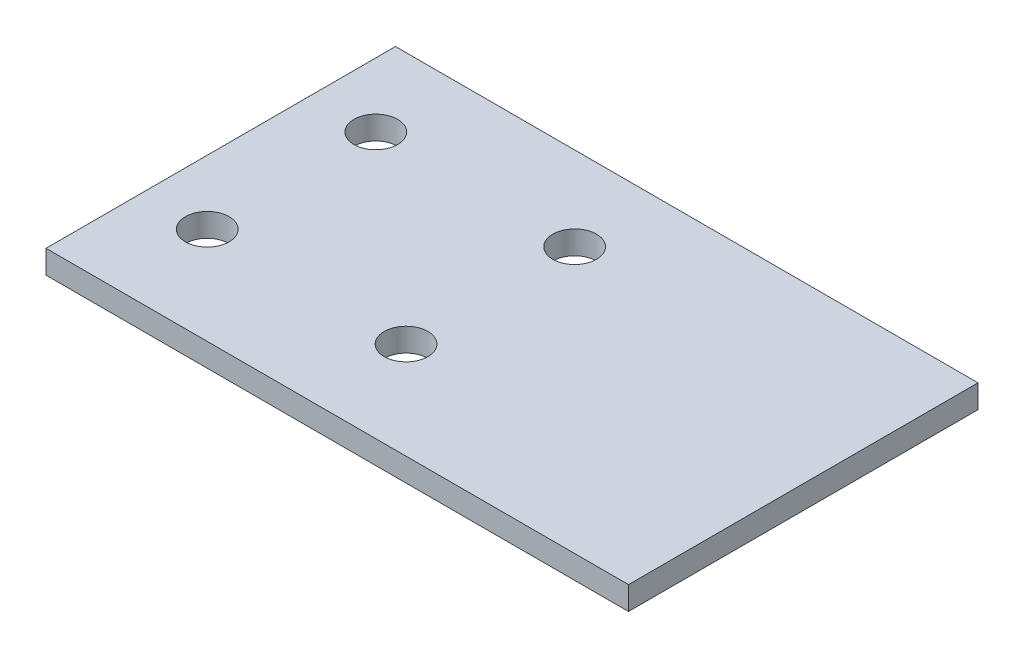
ISO-10303-21;
HEADER;
FILE_DESCRIPTION(('STEP AP214'),'2;1');
FILE_NAME('part.step','',(''),(''),'','','');
FILE_SCHEMA(('AUTOMOTIVE_DESIGN { 1 0 10303 214 1 1 1 1 }'));
ENDSEC;
DATA;
#1=APPLICATION_CONTEXT('core data for automotive mechanical design processes');
#2=APPLICATION_PROTOCOL_DEFINITION('international standard','automotive_design',2000,#1);
#3=PRODUCT_CONTEXT('',#1,'mechanical');
#4=PRODUCT('Part','Part','',(#3));
#5=PRODUCT_RELATED_PRODUCT_CATEGORY('part','',(#4));
#6=PRODUCT_DEFINITION_FORMATION('','',#4);
#7=PRODUCT_DEFINITION_CONTEXT('part definition',#1,'design');
#8=PRODUCT_DEFINITION('design','',#6,#7);
#9=PRODUCT_DEFINITION_SHAPE('','',#8);
#10=(LENGTH_UNIT() NAMED_UNIT(*) SI_UNIT(.MILLI.,.METRE.));
#11=(NAMED_UNIT(*) PLANE_ANGLE_UNIT() SI_UNIT($,.RADIAN.));
#12=(NAMED_UNIT(*) SI_UNIT($,.STERADIAN.) SOLID_ANGLE_UNIT());
#13=UNCERTAINTY_MEASURE_WITH_UNIT(LENGTH_MEASURE(1.E-05),#10,'distance_accuracy_value','');
#14=(GEOMETRIC_REPRESENTATION_CONTEXT(3) GLOBAL_UNCERTAINTY_ASSIGNED_CONTEXT((#13)) GLOBAL_UNIT_ASSIGNED_CONTEXT((#10,
#11,#12)) REPRESENTATION_CONTEXT('',''));
#15=CARTESIAN_POINT('',(0.,0.,0.));
#16=DIRECTION('',(0.,0.,1.));
#17=DIRECTION('',(1.,0.,0.));
#18=AXIS2_PLACEMENT_3D('',#15,#16,#17);
#19=CARTESIAN_POINT('',(-63.5,5.08,-38.1));
#20=DIRECTION('',(1.,0.,0.));
#21=DIRECTION('',(0.,0.,-1.));
#22=AXIS2_PLACEMENT_3D('',#19,#20,#21);
#23=PLANE('',#22);
#24=DIRECTION('',(0.,0.,1.));
#25=VECTOR('',#24,1.);
#26=CARTESIAN_POINT('',(-63.5,0.,-38.1));
#27=LINE('',#26,#25);
#28=CARTESIAN_POINT('',(-63.5,0.,-38.1));
#29=VERTEX_POINT('',#28);
#30=CARTESIAN_POINT('',(-63.5,0.,38.1));
#31=VERTEX_POINT('',#30);
#32=EDGE_CURVE('E96',#29,#31,#27,.T.);
#33=ORIENTED_EDGE('',*,*,#32,.T.);
#34=DIRECTION('',(0.,-1.,0.));
#35=VECTOR('',#34,1.);
#36=CARTESIAN_POINT('',(-63.5,5.08,38.1));
#37=LINE('',#36,#35);
#38=CARTESIAN_POINT('',(-63.5,5.08,38.1));
#39=VERTEX_POINT('',#38);
#40=EDGE_CURVE('E11',#39,#31,#37,.T.);
#41=ORIENTED_EDGE('',*,*,#40,.F.);
#42=DIRECTION('',(0.,0.,1.));
#43=VECTOR('',#42,1.);
#44=CARTESIAN_POINT('',(-63.5,5.08,-38.1));
#45=LINE('',#44,#43);
#46=CARTESIAN_POINT('',(-63.5,5.08,-38.1));
#47=VERTEX_POINT('',#46);
#48=EDGE_CURVE('E84',#47,#39,#45,.T.);
#49=ORIENTED_EDGE('',*,*,#48,.F.);
#50=DIRECTION('',(0.,-1.,0.));
#51=VECTOR('',#50,1.);
#52=CARTESIAN_POINT('',(-63.5,5.08,-38.1));
#53=LINE('',#52,#51);
#54=EDGE_CURVE('E92',#47,#29,#53,.T.);
#55=ORIENTED_EDGE('',*,*,#54,.T.);
#56=EDGE_LOOP('',(#33,#41,#49,#55));
#57=FACE_BOUND('',#56,.T.);
#58=ADVANCED_FACE('F33',(#57),#23,.F.);
#59=CARTESIAN_POINT('',(-63.5,5.08,38.1));
#60=DIRECTION('',(0.,0.,-1.));
#61=DIRECTION('',(-1.,0.,0.));
#62=AXIS2_PLACEMENT_3D('',#59,#60,#61);
#63=PLANE('',#62);
#64=DIRECTION('',(1.,0.,0.));
#65=VECTOR('',#64,1.);
#66=CARTESIAN_POINT('',(-63.5,0.,38.1));
#67=LINE('',#66,#65);
#68=CARTESIAN_POINT('',(63.5,0.,38.1));
#69=VERTEX_POINT('',#68);
#70=EDGE_CURVE('E88',#31,#69,#67,.T.);
#71=ORIENTED_EDGE('',*,*,#70,.T.);
#72=DIRECTION('',(0.,-1.,0.));
#73=VECTOR('',#72,1.);
#74=CARTESIAN_POINT('',(63.5,5.08,38.1));
#75=LINE('',#74,#73);
#76=CARTESIAN_POINT('',(63.5,5.08,38.1));
#77=VERTEX_POINT('',#76);
#78=EDGE_CURVE('E41',#77,#69,#75,.T.);
#79=ORIENTED_EDGE('',*,*,#78,.F.);
#80=DIRECTION('',(1.,0.,0.));
#81=VECTOR('',#80,1.);
#82=CARTESIAN_POINT('',(-63.5,5.08,38.1));
#83=LINE('',#82,#81);
#84=EDGE_CURVE('E79',#39,#77,#83,.T.);
#85=ORIENTED_EDGE('',*,*,#84,.F.);
#86=ORIENTED_EDGE('',*,*,#40,.T.);
#87=EDGE_LOOP('',(#71,#79,#85,#86));
#88=FACE_BOUND('',#87,.T.);
#89=ADVANCED_FACE('F87',(#88),#63,.F.);
#90=CARTESIAN_POINT('',(63.5,5.08,-38.1));
#91=DIRECTION('',(-1.,0.,0.));
#92=DIRECTION('',(0.,0.,1.));
#93=AXIS2_PLACEMENT_3D('',#90,#91,#92);
#94=PLANE('',#93);
#95=DIRECTION('',(0.,0.,-1.));
#96=VECTOR('',#95,1.);
#97=CARTESIAN_POINT('',(63.5,0.,-38.1));
#98=LINE('',#97,#96);
#99=CARTESIAN_POINT('',(63.5,0.,-38.1));
#100=VERTEX_POINT('',#99);
#101=EDGE_CURVE('E66',#69,#100,#98,.T.);
#102=ORIENTED_EDGE('',*,*,#101,.T.);
#103=DIRECTION('',(0.,-1.,0.));
#104=VECTOR('',#103,1.);
#105=CARTESIAN_POINT('',(63.5,5.08,-38.1));
#106=LINE('',#105,#104);
#107=CARTESIAN_POINT('',(63.5,5.08,-38.1));
#108=VERTEX_POINT('',#107);
#109=EDGE_CURVE('E89',#108,#100,#106,.T.);
#110=ORIENTED_EDGE('',*,*,#109,.F.);
#111=DIRECTION('',(0.,0.,-1.));
#112=VECTOR('',#111,1.);
#113=CARTESIAN_POINT('',(63.5,5.08,-38.1));
#114=LINE('',#113,#112);
#115=EDGE_CURVE('E82',#77,#108,#114,.T.);
#116=ORIENTED_EDGE('',*,*,#115,.F.);
#117=ORIENTED_EDGE('',*,*,#78,.T.);
#118=EDGE_LOOP('',(#102,#110,#116,#117));
#119=FACE_BOUND('',#118,.T.);
#120=ADVANCED_FACE('F90',(#119),#94,.F.);
#121=CARTESIAN_POINT('',(-63.5,5.08,-38.1));
#122=DIRECTION('',(0.,0.,1.));
#123=DIRECTION('',(1.,0.,0.));
#124=AXIS2_PLACEMENT_3D('',#121,#122,#123);
#125=PLANE('',#124);
#126=DIRECTION('',(-1.,0.,0.));
#127=VECTOR('',#126,1.);
#128=CARTESIAN_POINT('',(-63.5,0.,-38.1));
#129=LINE('',#128,#127);
#130=EDGE_CURVE('E72',#100,#29,#129,.T.);
#131=ORIENTED_EDGE('',*,*,#130,.T.);
#132=ORIENTED_EDGE('',*,*,#54,.F.);
#133=DIRECTION('',(-1.,0.,0.));
#134=VECTOR('',#133,1.);
#135=CARTESIAN_POINT('',(-63.5,5.08,-38.1));
#136=LINE('',#135,#134);
#137=EDGE_CURVE('E49',#108,#47,#136,.T.);
#138=ORIENTED_EDGE('',*,*,#137,.F.);
#139=ORIENTED_EDGE('',*,*,#109,.T.);
#140=EDGE_LOOP('',(#131,#132,#138,#139));
#141=FACE_BOUND('',#140,.T.);
#142=ADVANCED_FACE('F104',(#141),#125,.F.);
#143=CARTESIAN_POINT('',(0.,5.08,0.));
#144=DIRECTION('',(0.,1.,0.));
#145=DIRECTION('',(0.,0.,1.));
#146=AXIS2_PLACEMENT_3D('',#143,#144,#145);
#147=PLANE('',#146);
#148=CARTESIAN_POINT('',(-49.5183063762283,5.08,-19.8216987693911));
#149=DIRECTION('',(0.,1.,0.));
#150=DIRECTION('',(0.,0.,1.));
#151=AXIS2_PLACEMENT_3D('',#148,#149,#150);
#152=CIRCLE('',#151,4.76249999999999);
#153=CARTESIAN_POINT('',(-49.5183063762283,5.08,-15.0591987693911));
#154=VERTEX_POINT('',#153);
#155=EDGE_CURVE('E130',#154,#154,#152,.T.);
#156=ORIENTED_EDGE('',*,*,#155,.F.);
#157=EDGE_LOOP('',(#156));
#158=FACE_BOUND('',#157,.T.);
#159=CARTESIAN_POINT('',(-49.5183063762283,5.08,16.9294035983683));
#160=DIRECTION('',(0.,1.,0.));
#161=DIRECTION('',(0.,0.,1.));
#162=AXIS2_PLACEMENT_3D('',#159,#160,#161);
#163=CIRCLE('',#162,4.76249999999999);
#164=CARTESIAN_POINT('',(-49.5183063762283,5.08,21.6919035983682));
#165=VERTEX_POINT('',#164);
#166=EDGE_CURVE('E124',#165,#165,#163,.T.);
#167=ORIENTED_EDGE('',*,*,#166,.F.);
#168=EDGE_LOOP('',(#167));
#169=FACE_BOUND('',#168,.T.);
#170=CARTESIAN_POINT('',(-6.16754590751611,5.08,16.9294035983683));
#171=DIRECTION('',(0.,1.,0.));
#172=DIRECTION('',(0.,0.,1.));
#173=AXIS2_PLACEMENT_3D('',#170,#171,#172);
#174=CIRCLE('',#173,4.76249999999999);
#175=CARTESIAN_POINT('',(-6.16754590751611,5.08,21.6919035983682));
#176=VERTEX_POINT('',#175);
#177=EDGE_CURVE('E118',#176,#176,#174,.T.);
#178=ORIENTED_EDGE('',*,*,#177,.F.);
#179=EDGE_LOOP('',(#178));
#180=FACE_BOUND('',#179,.T.);
#181=CARTESIAN_POINT('',(-6.16754590751611,5.08,-19.8216987693911));
#182=DIRECTION('',(0.,1.,0.));
#183=DIRECTION('',(0.,0.,1.));
#184=AXIS2_PLACEMENT_3D('',#181,#182,#183);
#185=CIRCLE('',#184,4.76249999999999);
#186=CARTESIAN_POINT('',(-6.16754590751611,5.08,-15.0591987693911));
#187=VERTEX_POINT('',#186);
#188=EDGE_CURVE('E112',#187,#187,#185,.T.);
#189=ORIENTED_EDGE('',*,*,#188,.F.);
#190=EDGE_LOOP('',(#189));
#191=FACE_BOUND('',#190,.T.);
#192=ORIENTED_EDGE('',*,*,#48,.T.);
#193=ORIENTED_EDGE('',*,*,#84,.T.);
#194=ORIENTED_EDGE('',*,*,#115,.T.);
#195=ORIENTED_EDGE('',*,*,#137,.T.);
#196=EDGE_LOOP('',(#192,#193,#194,#195));
#197=FACE_BOUND('',#196,.T.);
#198=ADVANCED_FACE('F80',(#158,#169,#180,#191,#197),#147,.T.);
#199=CARTESIAN_POINT('',(0.,0.,0.));
#200=DIRECTION('',(0.,1.,0.));
#201=DIRECTION('',(0.,0.,1.));
#202=AXIS2_PLACEMENT_3D('',#199,#200,#201);
#203=PLANE('',#202);
#204=CARTESIAN_POINT('',(-49.5183063762283,0.,-19.8216987693911));
#205=DIRECTION('',(0.,1.,0.));
#206=DIRECTION('',(0.,0.,1.));
#207=AXIS2_PLACEMENT_3D('',#204,#205,#206);
#208=CIRCLE('',#207,4.7625);
#209=CARTESIAN_POINT('',(-49.5183063762283,0.,-15.0591987693911));
#210=VERTEX_POINT('',#209);
#211=EDGE_CURVE('E127',#210,#210,#208,.T.);
#212=ORIENTED_EDGE('',*,*,#211,.T.);
#213=EDGE_LOOP('',(#212));
#214=FACE_BOUND('',#213,.T.);
#215=CARTESIAN_POINT('',(-49.5183063762283,0.,16.9294035983683));
#216=DIRECTION('',(0.,1.,0.));
#217=DIRECTION('',(0.,0.,1.));
#218=AXIS2_PLACEMENT_3D('',#215,#216,#217);
#219=CIRCLE('',#218,4.7625);
#220=CARTESIAN_POINT('',(-49.5183063762283,0.,21.6919035983682));
#221=VERTEX_POINT('',#220);
#222=EDGE_CURVE('E121',#221,#221,#219,.T.);
#223=ORIENTED_EDGE('',*,*,#222,.T.);
#224=EDGE_LOOP('',(#223));
#225=FACE_BOUND('',#224,.T.);
#226=CARTESIAN_POINT('',(-6.16754590751611,0.,16.9294035983683));
#227=DIRECTION('',(0.,1.,0.));
#228=DIRECTION('',(0.,0.,1.));
#229=AXIS2_PLACEMENT_3D('',#226,#227,#228);
#230=CIRCLE('',#229,4.7625);
#231=CARTESIAN_POINT('',(-6.16754590751611,0.,21.6919035983682));
#232=VERTEX_POINT('',#231);
#233=EDGE_CURVE('E115',#232,#232,#230,.T.);
#234=ORIENTED_EDGE('',*,*,#233,.T.);
#235=EDGE_LOOP('',(#234));
#236=FACE_BOUND('',#235,.T.);
#237=CARTESIAN_POINT('',(-6.16754590751611,0.,-19.8216987693911));
#238=DIRECTION('',(0.,1.,0.));
#239=DIRECTION('',(0.,0.,1.));
#240=AXIS2_PLACEMENT_3D('',#237,#238,#239);
#241=CIRCLE('',#240,4.7625);
#242=CARTESIAN_POINT('',(-6.16754590751611,0.,-15.0591987693911));
#243=VERTEX_POINT('',#242);
#244=EDGE_CURVE('E99',#243,#243,#241,.T.);
#245=ORIENTED_EDGE('',*,*,#244,.T.);
#246=EDGE_LOOP('',(#245));
#247=FACE_BOUND('',#246,.T.);
#248=ORIENTED_EDGE('',*,*,#32,.F.);
#249=ORIENTED_EDGE('',*,*,#130,.F.);
#250=ORIENTED_EDGE('',*,*,#101,.F.);
#251=ORIENTED_EDGE('',*,*,#70,.F.);
#252=EDGE_LOOP('',(#248,#249,#250,#251));
#253=FACE_BOUND('',#252,.T.);
#254=ADVANCED_FACE('F107',(#214,#225,#236,#247,#253),#203,.F.);
#255=CARTESIAN_POINT('',(-6.16754590751611,5.08,-19.8216987693911));
#256=DIRECTION('',(0.,1.,0.));
#257=DIRECTION('',(0.,0.,1.));
#258=AXIS2_PLACEMENT_3D('',#255,#256,#257);
#259=CYLINDRICAL_SURFACE('',#258,4.76249999999999);
#260=ORIENTED_EDGE('',*,*,#244,.F.);
#261=EDGE_LOOP('',(#260));
#262=FACE_BOUND('',#261,.T.);
#263=ORIENTED_EDGE('',*,*,#188,.T.);
#264=EDGE_LOOP('',(#263));
#265=FACE_BOUND('',#264,.T.);
#266=ADVANCED_FACE('F145',(#262,#265),#259,.F.);
#267=CARTESIAN_POINT('',(-6.16754590751611,5.08,16.9294035983683));
#268=DIRECTION('',(0.,1.,0.));
#269=DIRECTION('',(0.,0.,1.));
#270=AXIS2_PLACEMENT_3D('',#267,#268,#269);
#271=CYLINDRICAL_SURFACE('',#270,4.76249999999999);
#272=ORIENTED_EDGE('',*,*,#233,.F.);
#273=EDGE_LOOP('',(#272));
#274=FACE_BOUND('',#273,.T.);
#275=ORIENTED_EDGE('',*,*,#177,.T.);
#276=EDGE_LOOP('',(#275));
#277=FACE_BOUND('',#276,.T.);
#278=ADVANCED_FACE('F147',(#274,#277),#271,.F.);
#279=CARTESIAN_POINT('',(-49.5183063762283,5.08,16.9294035983683));
#280=DIRECTION('',(0.,1.,0.));
#281=DIRECTION('',(0.,0.,1.));
#282=AXIS2_PLACEMENT_3D('',#279,#280,#281);
#283=CYLINDRICAL_SURFACE('',#282,4.76249999999999);
#284=ORIENTED_EDGE('',*,*,#222,.F.);
#285=EDGE_LOOP('',(#284));
#286=FACE_BOUND('',#285,.T.);
#287=ORIENTED_EDGE('',*,*,#166,.T.);
#288=EDGE_LOOP('',(#287));
#289=FACE_BOUND('',#288,.T.);
#290=ADVANCED_FACE('F154',(#286,#289),#283,.F.);
#291=CARTESIAN_POINT('',(-49.5183063762283,5.08,-19.8216987693911));
#292=DIRECTION('',(0.,1.,0.));
#293=DIRECTION('',(0.,0.,1.));
#294=AXIS2_PLACEMENT_3D('',#291,#292,#293);
#295=CYLINDRICAL_SURFACE('',#294,4.76249999999999);
#296=ORIENTED_EDGE('',*,*,#211,.F.);
#297=EDGE_LOOP('',(#296));
#298=FACE_BOUND('',#297,.T.);
#299=ORIENTED_EDGE('',*,*,#155,.T.);
#300=EDGE_LOOP('',(#299));
#301=FACE_BOUND('',#300,.T.);
#302=ADVANCED_FACE('F134',(#298,#301),#295,.F.);
#303=CLOSED_SHELL('',(#58,#89,#120,#142,#198,#254,#266,#278,#290,#302));
#304=MANIFOLD_SOLID_BREP('B2',#303);
#305=ADVANCED_BREP_SHAPE_REPRESENTATION('',(#18,#304),#14);
#306=SHAPE_DEFINITION_REPRESENTATION(#9,#305);
ENDSEC;
END-ISO-10303-21;
